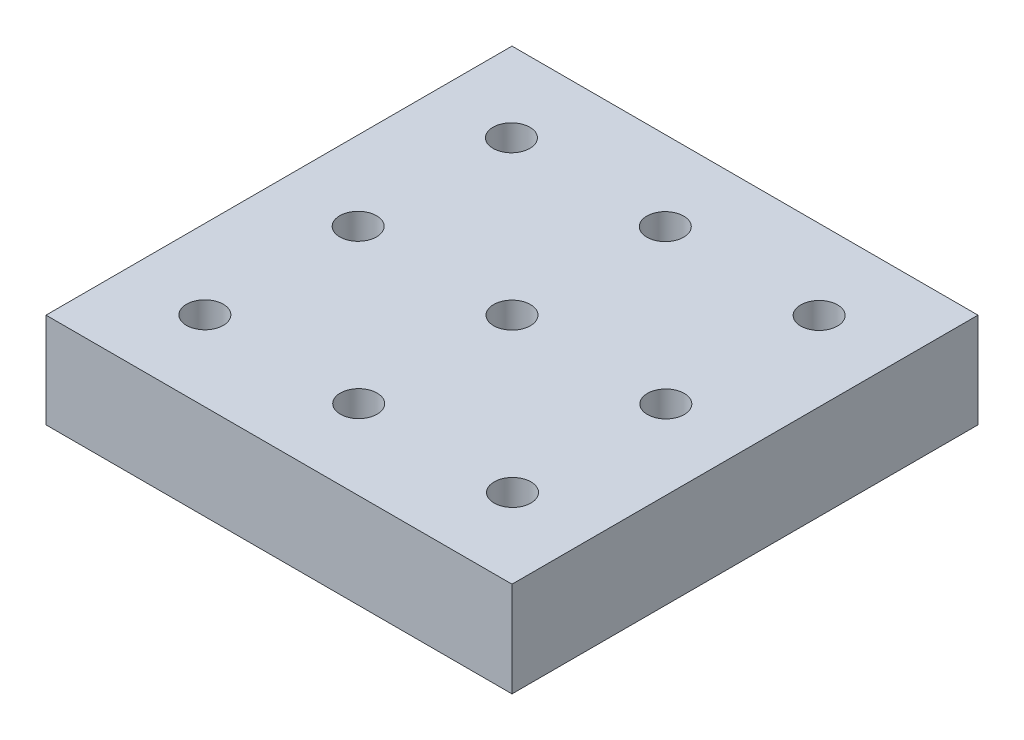
ISO-10303-21;
HEADER;
FILE_DESCRIPTION(('STEP AP214'),'2;1');
FILE_NAME('part.step','',(''),(''),'','','');
FILE_SCHEMA(('AUTOMOTIVE_DESIGN { 1 0 10303 214 1 1 1 1 }'));
ENDSEC;
DATA;
#1=APPLICATION_CONTEXT('core data for automotive mechanical design processes');
#2=APPLICATION_PROTOCOL_DEFINITION('international standard','automotive_design',2000,#1);
#3=PRODUCT_CONTEXT('',#1,'mechanical');
#4=PRODUCT('Part','Part','',(#3));
#5=PRODUCT_RELATED_PRODUCT_CATEGORY('part','',(#4));
#6=PRODUCT_DEFINITION_FORMATION('','',#4);
#7=PRODUCT_DEFINITION_CONTEXT('part definition',#1,'design');
#8=PRODUCT_DEFINITION('design','',#6,#7);
#9=PRODUCT_DEFINITION_SHAPE('','',#8);
#10=(LENGTH_UNIT() NAMED_UNIT(*) SI_UNIT(.MILLI.,.METRE.));
#11=(NAMED_UNIT(*) PLANE_ANGLE_UNIT() SI_UNIT($,.RADIAN.));
#12=(NAMED_UNIT(*) SI_UNIT($,.STERADIAN.) SOLID_ANGLE_UNIT());
#13=UNCERTAINTY_MEASURE_WITH_UNIT(LENGTH_MEASURE(1.E-05),#10,'distance_accuracy_value','');
#14=(GEOMETRIC_REPRESENTATION_CONTEXT(3) GLOBAL_UNCERTAINTY_ASSIGNED_CONTEXT((#13)) GLOBAL_UNIT_ASSIGNED_CONTEXT((#10,
#11,#12)) REPRESENTATION_CONTEXT('',''));
#15=CARTESIAN_POINT('',(0.,0.,0.));
#16=DIRECTION('',(0.,0.,1.));
#17=DIRECTION('',(1.,0.,0.));
#18=AXIS2_PLACEMENT_3D('',#15,#16,#17);
#19=CARTESIAN_POINT('',(0.,15.5,0.));
#20=DIRECTION('',(0.,1.,0.));
#21=DIRECTION('',(0.,0.,1.));
#22=AXIS2_PLACEMENT_3D('',#19,#20,#21);
#23=PLANE('',#22);
#24=CARTESIAN_POINT('',(-159.859666299944,15.5,-56.7102196791404));
#25=DIRECTION('',(0.,1.,0.));
#26=DIRECTION('',(0.,0.,-1.));
#27=AXIS2_PLACEMENT_3D('',#24,#25,#26);
#28=CIRCLE('',#27,2.99999999999999);
#29=CARTESIAN_POINT('',(-159.859666299944,15.5,-59.7102196791404));
#30=VERTEX_POINT('',#29);
#31=EDGE_CURVE('E150',#30,#30,#28,.T.);
#32=ORIENTED_EDGE('',*,*,#31,.F.);
#33=EDGE_LOOP('',(#32));
#34=FACE_BOUND('',#33,.T.);
#35=CARTESIAN_POINT('',(-134.769453056282,15.5,-106.71021967914));
#36=DIRECTION('',(0.,1.,0.));
#37=DIRECTION('',(0.,0.,1.));
#38=AXIS2_PLACEMENT_3D('',#35,#36,#37);
#39=CIRCLE('',#38,2.99999999999999);
#40=CARTESIAN_POINT('',(-134.769453056282,15.5,-103.71021967914));
#41=VERTEX_POINT('',#40);
#42=EDGE_CURVE('E138',#41,#41,#39,.T.);
#43=ORIENTED_EDGE('',*,*,#42,.F.);
#44=EDGE_LOOP('',(#43));
#45=FACE_BOUND('',#44,.T.);
#46=CARTESIAN_POINT('',(-134.769453056282,15.5,-56.7102196791404));
#47=DIRECTION('',(0.,1.,0.));
#48=DIRECTION('',(0.,0.,-1.));
#49=AXIS2_PLACEMENT_3D('',#46,#47,#48);
#50=CIRCLE('',#49,2.99999999999999);
#51=CARTESIAN_POINT('',(-134.769453056282,15.5,-59.7102196791404));
#52=VERTEX_POINT('',#51);
#53=EDGE_CURVE('E126',#52,#52,#50,.T.);
#54=ORIENTED_EDGE('',*,*,#53,.F.);
#55=EDGE_LOOP('',(#54));
#56=FACE_BOUND('',#55,.T.);
#57=CARTESIAN_POINT('',(-134.769453056282,15.5,-81.7102196791404));
#58=DIRECTION('',(0.,1.,0.));
#59=DIRECTION('',(0.,0.,1.));
#60=AXIS2_PLACEMENT_3D('',#57,#58,#59);
#61=CIRCLE('',#60,3.00000000000002);
#62=CARTESIAN_POINT('',(-134.769453056282,15.5,-78.7102196791404));
#63=VERTEX_POINT('',#62);
#64=EDGE_CURVE('E114',#63,#63,#61,.T.);
#65=ORIENTED_EDGE('',*,*,#64,.F.);
#66=EDGE_LOOP('',(#65));
#67=FACE_BOUND('',#66,.T.);
#68=DIRECTION('',(1.,0.,0.));
#69=VECTOR('',#68,1.);
#70=CARTESIAN_POINT('',(-197.859666299944,15.5,-43.7102196791404));
#71=LINE('',#70,#69);
#72=CARTESIAN_POINT('',(-197.859666299944,15.5,-43.7102196791404));
#73=VERTEX_POINT('',#72);
#74=CARTESIAN_POINT('',(-121.859666299944,15.5,-43.7102196791404));
#75=VERTEX_POINT('',#74);
#76=EDGE_CURVE('E84',#73,#75,#71,.T.);
#77=ORIENTED_EDGE('',*,*,#76,.T.);
#78=DIRECTION('',(0.,0.,-1.));
#79=VECTOR('',#78,1.);
#80=CARTESIAN_POINT('',(-121.859666299944,15.5,-43.7102196791404));
#81=LINE('',#80,#79);
#82=CARTESIAN_POINT('',(-121.859666299944,15.5,-119.71021967914));
#83=VERTEX_POINT('',#82);
#84=EDGE_CURVE('E79',#75,#83,#81,.T.);
#85=ORIENTED_EDGE('',*,*,#84,.T.);
#86=DIRECTION('',(-1.,0.,0.));
#87=VECTOR('',#86,1.);
#88=CARTESIAN_POINT('',(-121.859666299944,15.5,-119.71021967914));
#89=LINE('',#88,#87);
#90=CARTESIAN_POINT('',(-197.859666299944,15.5,-119.71021967914));
#91=VERTEX_POINT('',#90);
#92=EDGE_CURVE('E82',#83,#91,#89,.T.);
#93=ORIENTED_EDGE('',*,*,#92,.T.);
#94=DIRECTION('',(0.,0.,1.));
#95=VECTOR('',#94,1.);
#96=CARTESIAN_POINT('',(-197.859666299944,15.5,-119.71021967914));
#97=LINE('',#96,#95);
#98=EDGE_CURVE('E49',#91,#73,#97,.T.);
#99=ORIENTED_EDGE('',*,*,#98,.T.);
#100=EDGE_LOOP('',(#77,#85,#93,#99));
#101=FACE_BOUND('',#100,.T.);
#102=CARTESIAN_POINT('',(-159.859666299944,15.5,-81.7102196791404));
#103=DIRECTION('',(0.,1.,0.));
#104=DIRECTION('',(0.,0.,1.));
#105=AXIS2_PLACEMENT_3D('',#102,#103,#104);
#106=CIRCLE('',#105,2.99999999999999);
#107=CARTESIAN_POINT('',(-159.859666299944,15.5,-78.7102196791404));
#108=VERTEX_POINT('',#107);
#109=EDGE_CURVE('E99',#108,#108,#106,.T.);
#110=ORIENTED_EDGE('',*,*,#109,.F.);
#111=EDGE_LOOP('',(#110));
#112=FACE_BOUND('',#111,.T.);
#113=CARTESIAN_POINT('',(-184.949879543606,15.5,-81.7102196791404));
#114=DIRECTION('',(0.,1.,0.));
#115=DIRECTION('',(0.,0.,-1.));
#116=AXIS2_PLACEMENT_3D('',#113,#114,#115);
#117=CIRCLE('',#116,3.00000000000002);
#118=CARTESIAN_POINT('',(-184.949879543606,15.5,-84.7102196791404));
#119=VERTEX_POINT('',#118);
#120=EDGE_CURVE('E120',#119,#119,#117,.T.);
#121=ORIENTED_EDGE('',*,*,#120,.F.);
#122=EDGE_LOOP('',(#121));
#123=FACE_BOUND('',#122,.T.);
#124=CARTESIAN_POINT('',(-159.859666299944,15.5,-106.71021967914));
#125=DIRECTION('',(0.,1.,0.));
#126=DIRECTION('',(0.,0.,1.));
#127=AXIS2_PLACEMENT_3D('',#124,#125,#126);
#128=CIRCLE('',#127,2.99999999999999);
#129=CARTESIAN_POINT('',(-159.859666299944,15.5,-103.71021967914));
#130=VERTEX_POINT('',#129);
#131=EDGE_CURVE('E132',#130,#130,#128,.T.);
#132=ORIENTED_EDGE('',*,*,#131,.F.);
#133=EDGE_LOOP('',(#132));
#134=FACE_BOUND('',#133,.T.);
#135=CARTESIAN_POINT('',(-184.949879543606,15.5,-106.71021967914));
#136=DIRECTION('',(0.,1.,0.));
#137=DIRECTION('',(0.,0.,-1.));
#138=AXIS2_PLACEMENT_3D('',#135,#136,#137);
#139=CIRCLE('',#138,3.00000000000002);
#140=CARTESIAN_POINT('',(-184.949879543606,15.5,-109.71021967914));
#141=VERTEX_POINT('',#140);
#142=EDGE_CURVE('E144',#141,#141,#139,.T.);
#143=ORIENTED_EDGE('',*,*,#142,.F.);
#144=EDGE_LOOP('',(#143));
#145=FACE_BOUND('',#144,.T.);
#146=CARTESIAN_POINT('',(-184.949879543606,15.5,-56.7102196791404));
#147=DIRECTION('',(0.,1.,0.));
#148=DIRECTION('',(0.,0.,1.));
#149=AXIS2_PLACEMENT_3D('',#146,#147,#148);
#150=CIRCLE('',#149,3.00000000000002);
#151=CARTESIAN_POINT('',(-184.949879543606,15.5,-53.7102196791404));
#152=VERTEX_POINT('',#151);
#153=EDGE_CURVE('E156',#152,#152,#150,.T.);
#154=ORIENTED_EDGE('',*,*,#153,.F.);
#155=EDGE_LOOP('',(#154));
#156=FACE_BOUND('',#155,.T.);
#157=ADVANCED_FACE('F32',(#34,#45,#56,#67,#101,#112,#123,#134,#145,#156),#23,.T.);
#158=CARTESIAN_POINT('',(0.,0.,0.));
#159=DIRECTION('',(0.,1.,0.));
#160=DIRECTION('',(0.,0.,1.));
#161=AXIS2_PLACEMENT_3D('',#158,#159,#160);
#162=PLANE('',#161);
#163=CARTESIAN_POINT('',(-159.859666299944,0.,-56.7102196791404));
#164=DIRECTION('',(0.,1.,0.));
#165=DIRECTION('',(0.,0.,-1.));
#166=AXIS2_PLACEMENT_3D('',#163,#164,#165);
#167=CIRCLE('',#166,2.99999999999999);
#168=CARTESIAN_POINT('',(-159.859666299944,0.,-59.7102196791404));
#169=VERTEX_POINT('',#168);
#170=EDGE_CURVE('E153',#169,#169,#167,.T.);
#171=ORIENTED_EDGE('',*,*,#170,.T.);
#172=EDGE_LOOP('',(#171));
#173=FACE_BOUND('',#172,.T.);
#174=CARTESIAN_POINT('',(-134.769453056282,0.,-106.71021967914));
#175=DIRECTION('',(0.,1.,0.));
#176=DIRECTION('',(0.,0.,1.));
#177=AXIS2_PLACEMENT_3D('',#174,#175,#176);
#178=CIRCLE('',#177,2.99999999999999);
#179=CARTESIAN_POINT('',(-134.769453056282,0.,-103.71021967914));
#180=VERTEX_POINT('',#179);
#181=EDGE_CURVE('E141',#180,#180,#178,.T.);
#182=ORIENTED_EDGE('',*,*,#181,.T.);
#183=EDGE_LOOP('',(#182));
#184=FACE_BOUND('',#183,.T.);
#185=CARTESIAN_POINT('',(-134.769453056282,0.,-56.7102196791404));
#186=DIRECTION('',(0.,1.,0.));
#187=DIRECTION('',(0.,0.,-1.));
#188=AXIS2_PLACEMENT_3D('',#185,#186,#187);
#189=CIRCLE('',#188,2.99999999999999);
#190=CARTESIAN_POINT('',(-134.769453056282,0.,-59.7102196791404));
#191=VERTEX_POINT('',#190);
#192=EDGE_CURVE('E129',#191,#191,#189,.T.);
#193=ORIENTED_EDGE('',*,*,#192,.T.);
#194=EDGE_LOOP('',(#193));
#195=FACE_BOUND('',#194,.T.);
#196=CARTESIAN_POINT('',(-134.769453056282,0.,-81.7102196791404));
#197=DIRECTION('',(0.,1.,0.));
#198=DIRECTION('',(0.,0.,1.));
#199=AXIS2_PLACEMENT_3D('',#196,#197,#198);
#200=CIRCLE('',#199,3.00000000000002);
#201=CARTESIAN_POINT('',(-134.769453056282,0.,-78.7102196791404));
#202=VERTEX_POINT('',#201);
#203=EDGE_CURVE('E117',#202,#202,#200,.T.);
#204=ORIENTED_EDGE('',*,*,#203,.T.);
#205=EDGE_LOOP('',(#204));
#206=FACE_BOUND('',#205,.T.);
#207=DIRECTION('',(1.,0.,0.));
#208=VECTOR('',#207,1.);
#209=CARTESIAN_POINT('',(-197.859666299944,0.,-43.7102196791404));
#210=LINE('',#209,#208);
#211=CARTESIAN_POINT('',(-197.859666299944,0.,-43.7102196791404));
#212=VERTEX_POINT('',#211);
#213=CARTESIAN_POINT('',(-121.859666299944,0.,-43.7102196791404));
#214=VERTEX_POINT('',#213);
#215=EDGE_CURVE('E96',#212,#214,#210,.T.);
#216=ORIENTED_EDGE('',*,*,#215,.F.);
#217=DIRECTION('',(0.,0.,1.));
#218=VECTOR('',#217,1.);
#219=CARTESIAN_POINT('',(-197.859666299944,0.,-119.71021967914));
#220=LINE('',#219,#218);
#221=CARTESIAN_POINT('',(-197.859666299944,0.,-119.71021967914));
#222=VERTEX_POINT('',#221);
#223=EDGE_CURVE('E72',#222,#212,#220,.T.);
#224=ORIENTED_EDGE('',*,*,#223,.F.);
#225=DIRECTION('',(-1.,0.,0.));
#226=VECTOR('',#225,1.);
#227=CARTESIAN_POINT('',(-121.859666299944,0.,-119.71021967914));
#228=LINE('',#227,#226);
#229=CARTESIAN_POINT('',(-121.859666299944,0.,-119.71021967914));
#230=VERTEX_POINT('',#229);
#231=EDGE_CURVE('E66',#230,#222,#228,.T.);
#232=ORIENTED_EDGE('',*,*,#231,.F.);
#233=DIRECTION('',(0.,0.,-1.));
#234=VECTOR('',#233,1.);
#235=CARTESIAN_POINT('',(-121.859666299944,0.,-43.7102196791404));
#236=LINE('',#235,#234);
#237=EDGE_CURVE('E88',#214,#230,#236,.T.);
#238=ORIENTED_EDGE('',*,*,#237,.F.);
#239=EDGE_LOOP('',(#216,#224,#232,#238));
#240=FACE_BOUND('',#239,.T.);
#241=CARTESIAN_POINT('',(-159.859666299944,0.,-81.7102196791404));
#242=DIRECTION('',(0.,1.,0.));
#243=DIRECTION('',(0.,0.,1.));
#244=AXIS2_PLACEMENT_3D('',#241,#242,#243);
#245=CIRCLE('',#244,2.99999999999999);
#246=CARTESIAN_POINT('',(-159.859666299944,0.,-78.7102196791404));
#247=VERTEX_POINT('',#246);
#248=EDGE_CURVE('E111',#247,#247,#245,.T.);
#249=ORIENTED_EDGE('',*,*,#248,.T.);
#250=EDGE_LOOP('',(#249));
#251=FACE_BOUND('',#250,.T.);
#252=CARTESIAN_POINT('',(-184.949879543606,0.,-81.7102196791404));
#253=DIRECTION('',(0.,1.,0.));
#254=DIRECTION('',(0.,0.,-1.));
#255=AXIS2_PLACEMENT_3D('',#252,#253,#254);
#256=CIRCLE('',#255,3.00000000000002);
#257=CARTESIAN_POINT('',(-184.949879543606,0.,-84.7102196791404));
#258=VERTEX_POINT('',#257);
#259=EDGE_CURVE('E123',#258,#258,#256,.T.);
#260=ORIENTED_EDGE('',*,*,#259,.T.);
#261=EDGE_LOOP('',(#260));
#262=FACE_BOUND('',#261,.T.);
#263=CARTESIAN_POINT('',(-159.859666299944,0.,-106.71021967914));
#264=DIRECTION('',(0.,1.,0.));
#265=DIRECTION('',(0.,0.,1.));
#266=AXIS2_PLACEMENT_3D('',#263,#264,#265);
#267=CIRCLE('',#266,2.99999999999999);
#268=CARTESIAN_POINT('',(-159.859666299944,0.,-103.71021967914));
#269=VERTEX_POINT('',#268);
#270=EDGE_CURVE('E135',#269,#269,#267,.T.);
#271=ORIENTED_EDGE('',*,*,#270,.T.);
#272=EDGE_LOOP('',(#271));
#273=FACE_BOUND('',#272,.T.);
#274=CARTESIAN_POINT('',(-184.949879543606,0.,-106.71021967914));
#275=DIRECTION('',(0.,1.,0.));
#276=DIRECTION('',(0.,0.,-1.));
#277=AXIS2_PLACEMENT_3D('',#274,#275,#276);
#278=CIRCLE('',#277,3.00000000000002);
#279=CARTESIAN_POINT('',(-184.949879543606,0.,-109.71021967914));
#280=VERTEX_POINT('',#279);
#281=EDGE_CURVE('E147',#280,#280,#278,.T.);
#282=ORIENTED_EDGE('',*,*,#281,.T.);
#283=EDGE_LOOP('',(#282));
#284=FACE_BOUND('',#283,.T.);
#285=CARTESIAN_POINT('',(-184.949879543606,0.,-56.7102196791404));
#286=DIRECTION('',(0.,1.,0.));
#287=DIRECTION('',(0.,0.,1.));
#288=AXIS2_PLACEMENT_3D('',#285,#286,#287);
#289=CIRCLE('',#288,3.00000000000002);
#290=CARTESIAN_POINT('',(-184.949879543606,0.,-53.7102196791404));
#291=VERTEX_POINT('',#290);
#292=EDGE_CURVE('E159',#291,#291,#289,.T.);
#293=ORIENTED_EDGE('',*,*,#292,.T.);
#294=EDGE_LOOP('',(#293));
#295=FACE_BOUND('',#294,.T.);
#296=ADVANCED_FACE('F107',(#173,#184,#195,#206,#240,#251,#262,#273,#284,#295),#162,.F.);
#297=CARTESIAN_POINT('',(-197.859666299944,15.5,-43.7102196791404));
#298=DIRECTION('',(0.,0.,-1.));
#299=DIRECTION('',(-1.,0.,0.));
#300=AXIS2_PLACEMENT_3D('',#297,#298,#299);
#301=PLANE('',#300);
#302=ORIENTED_EDGE('',*,*,#215,.T.);
#303=DIRECTION('',(0.,-1.,0.));
#304=VECTOR('',#303,1.);
#305=CARTESIAN_POINT('',(-121.859666299944,15.5,-43.7102196791404));
#306=LINE('',#305,#304);
#307=EDGE_CURVE('E11',#75,#214,#306,.T.);
#308=ORIENTED_EDGE('',*,*,#307,.F.);
#309=ORIENTED_EDGE('',*,*,#76,.F.);
#310=DIRECTION('',(0.,-1.,0.));
#311=VECTOR('',#310,1.);
#312=CARTESIAN_POINT('',(-197.859666299944,15.5,-43.7102196791404));
#313=LINE('',#312,#311);
#314=EDGE_CURVE('E92',#73,#212,#313,.T.);
#315=ORIENTED_EDGE('',*,*,#314,.T.);
#316=EDGE_LOOP('',(#302,#308,#309,#315));
#317=FACE_BOUND('',#316,.T.);
#318=ADVANCED_FACE('F34',(#317),#301,.F.);
#319=CARTESIAN_POINT('',(-121.859666299944,15.5,-43.7102196791404));
#320=DIRECTION('',(-1.,0.,0.));
#321=DIRECTION('',(0.,0.,1.));
#322=AXIS2_PLACEMENT_3D('',#319,#320,#321);
#323=PLANE('',#322);
#324=ORIENTED_EDGE('',*,*,#237,.T.);
#325=DIRECTION('',(0.,-1.,0.));
#326=VECTOR('',#325,1.);
#327=CARTESIAN_POINT('',(-121.859666299944,15.5,-119.71021967914));
#328=LINE('',#327,#326);
#329=EDGE_CURVE('E41',#83,#230,#328,.T.);
#330=ORIENTED_EDGE('',*,*,#329,.F.);
#331=ORIENTED_EDGE('',*,*,#84,.F.);
#332=ORIENTED_EDGE('',*,*,#307,.T.);
#333=EDGE_LOOP('',(#324,#330,#331,#332));
#334=FACE_BOUND('',#333,.T.);
#335=ADVANCED_FACE('F87',(#334),#323,.F.);
#336=CARTESIAN_POINT('',(-121.859666299944,15.5,-119.71021967914));
#337=DIRECTION('',(0.,0.,1.));
#338=DIRECTION('',(1.,0.,0.));
#339=AXIS2_PLACEMENT_3D('',#336,#337,#338);
#340=PLANE('',#339);
#341=ORIENTED_EDGE('',*,*,#231,.T.);
#342=DIRECTION('',(0.,-1.,0.));
#343=VECTOR('',#342,1.);
#344=CARTESIAN_POINT('',(-197.859666299944,15.5,-119.71021967914));
#345=LINE('',#344,#343);
#346=EDGE_CURVE('E89',#91,#222,#345,.T.);
#347=ORIENTED_EDGE('',*,*,#346,.F.);
#348=ORIENTED_EDGE('',*,*,#92,.F.);
#349=ORIENTED_EDGE('',*,*,#329,.T.);
#350=EDGE_LOOP('',(#341,#347,#348,#349));
#351=FACE_BOUND('',#350,.T.);
#352=ADVANCED_FACE('F90',(#351),#340,.F.);
#353=CARTESIAN_POINT('',(-197.859666299944,15.5,-119.71021967914));
#354=DIRECTION('',(1.,0.,0.));
#355=DIRECTION('',(0.,0.,-1.));
#356=AXIS2_PLACEMENT_3D('',#353,#354,#355);
#357=PLANE('',#356);
#358=ORIENTED_EDGE('',*,*,#223,.T.);
#359=ORIENTED_EDGE('',*,*,#314,.F.);
#360=ORIENTED_EDGE('',*,*,#98,.F.);
#361=ORIENTED_EDGE('',*,*,#346,.T.);
#362=EDGE_LOOP('',(#358,#359,#360,#361));
#363=FACE_BOUND('',#362,.T.);
#364=ADVANCED_FACE('F104',(#363),#357,.F.);
#365=CARTESIAN_POINT('',(-159.859666299944,15.5,-81.7102196791404));
#366=DIRECTION('',(0.,-1.,0.));
#367=DIRECTION('',(0.,0.,-1.));
#368=AXIS2_PLACEMENT_3D('',#365,#366,#367);
#369=CYLINDRICAL_SURFACE('',#368,2.99999999999999);
#370=ORIENTED_EDGE('',*,*,#109,.T.);
#371=EDGE_LOOP('',(#370));
#372=FACE_BOUND('',#371,.T.);
#373=ORIENTED_EDGE('',*,*,#248,.F.);
#374=EDGE_LOOP('',(#373));
#375=FACE_BOUND('',#374,.T.);
#376=ADVANCED_FACE('F179',(#372,#375),#369,.F.);
#377=CARTESIAN_POINT('',(-134.769453056282,15.5,-81.7102196791404));
#378=DIRECTION('',(0.,-1.,0.));
#379=DIRECTION('',(0.,0.,-1.));
#380=AXIS2_PLACEMENT_3D('',#377,#378,#379);
#381=CYLINDRICAL_SURFACE('',#380,3.00000000000002);
#382=ORIENTED_EDGE('',*,*,#64,.T.);
#383=EDGE_LOOP('',(#382));
#384=FACE_BOUND('',#383,.T.);
#385=ORIENTED_EDGE('',*,*,#203,.F.);
#386=EDGE_LOOP('',(#385));
#387=FACE_BOUND('',#386,.T.);
#388=ADVANCED_FACE('F225',(#384,#387),#381,.F.);
#389=CARTESIAN_POINT('',(-184.949879543606,15.5,-81.7102196791404));
#390=DIRECTION('',(0.,-1.,0.));
#391=DIRECTION('',(0.,0.,-1.));
#392=AXIS2_PLACEMENT_3D('',#389,#390,#391);
#393=CYLINDRICAL_SURFACE('',#392,3.00000000000002);
#394=ORIENTED_EDGE('',*,*,#120,.T.);
#395=EDGE_LOOP('',(#394));
#396=FACE_BOUND('',#395,.T.);
#397=ORIENTED_EDGE('',*,*,#259,.F.);
#398=EDGE_LOOP('',(#397));
#399=FACE_BOUND('',#398,.T.);
#400=ADVANCED_FACE('F233',(#396,#399),#393,.F.);
#401=CARTESIAN_POINT('',(-134.769453056282,15.5,-56.7102196791404));
#402=DIRECTION('',(0.,-1.,0.));
#403=DIRECTION('',(0.,0.,-1.));
#404=AXIS2_PLACEMENT_3D('',#401,#402,#403);
#405=CYLINDRICAL_SURFACE('',#404,2.99999999999999);
#406=ORIENTED_EDGE('',*,*,#53,.T.);
#407=EDGE_LOOP('',(#406));
#408=FACE_BOUND('',#407,.T.);
#409=ORIENTED_EDGE('',*,*,#192,.F.);
#410=EDGE_LOOP('',(#409));
#411=FACE_BOUND('',#410,.T.);
#412=ADVANCED_FACE('F241',(#408,#411),#405,.F.);
#413=CARTESIAN_POINT('',(-159.859666299944,15.5,-106.71021967914));
#414=DIRECTION('',(0.,-1.,0.));
#415=DIRECTION('',(0.,0.,-1.));
#416=AXIS2_PLACEMENT_3D('',#413,#414,#415);
#417=CYLINDRICAL_SURFACE('',#416,2.99999999999999);
#418=ORIENTED_EDGE('',*,*,#131,.T.);
#419=EDGE_LOOP('',(#418));
#420=FACE_BOUND('',#419,.T.);
#421=ORIENTED_EDGE('',*,*,#270,.F.);
#422=EDGE_LOOP('',(#421));
#423=FACE_BOUND('',#422,.T.);
#424=ADVANCED_FACE('F250',(#420,#423),#417,.F.);
#425=CARTESIAN_POINT('',(-134.769453056282,15.5,-106.71021967914));
#426=DIRECTION('',(0.,-1.,0.));
#427=DIRECTION('',(0.,0.,-1.));
#428=AXIS2_PLACEMENT_3D('',#425,#426,#427);
#429=CYLINDRICAL_SURFACE('',#428,2.99999999999999);
#430=ORIENTED_EDGE('',*,*,#42,.T.);
#431=EDGE_LOOP('',(#430));
#432=FACE_BOUND('',#431,.T.);
#433=ORIENTED_EDGE('',*,*,#181,.F.);
#434=EDGE_LOOP('',(#433));
#435=FACE_BOUND('',#434,.T.);
#436=ADVANCED_FACE('F259',(#432,#435),#429,.F.);
#437=CARTESIAN_POINT('',(-184.949879543606,15.5,-106.71021967914));
#438=DIRECTION('',(0.,-1.,0.));
#439=DIRECTION('',(0.,0.,-1.));
#440=AXIS2_PLACEMENT_3D('',#437,#438,#439);
#441=CYLINDRICAL_SURFACE('',#440,3.00000000000002);
#442=ORIENTED_EDGE('',*,*,#142,.T.);
#443=EDGE_LOOP('',(#442));
#444=FACE_BOUND('',#443,.T.);
#445=ORIENTED_EDGE('',*,*,#281,.F.);
#446=EDGE_LOOP('',(#445));
#447=FACE_BOUND('',#446,.T.);
#448=ADVANCED_FACE('F268',(#444,#447),#441,.F.);
#449=CARTESIAN_POINT('',(-159.859666299944,15.5,-56.7102196791404));
#450=DIRECTION('',(0.,-1.,0.));
#451=DIRECTION('',(0.,0.,-1.));
#452=AXIS2_PLACEMENT_3D('',#449,#450,#451);
#453=CYLINDRICAL_SURFACE('',#452,2.99999999999999);
#454=ORIENTED_EDGE('',*,*,#31,.T.);
#455=EDGE_LOOP('',(#454));
#456=FACE_BOUND('',#455,.T.);
#457=ORIENTED_EDGE('',*,*,#170,.F.);
#458=EDGE_LOOP('',(#457));
#459=FACE_BOUND('',#458,.T.);
#460=ADVANCED_FACE('F277',(#456,#459),#453,.F.);
#461=CARTESIAN_POINT('',(-184.949879543606,15.5,-56.7102196791404));
#462=DIRECTION('',(0.,-1.,0.));
#463=DIRECTION('',(0.,0.,-1.));
#464=AXIS2_PLACEMENT_3D('',#461,#462,#463);
#465=CYLINDRICAL_SURFACE('',#464,3.00000000000002);
#466=ORIENTED_EDGE('',*,*,#153,.T.);
#467=EDGE_LOOP('',(#466));
#468=FACE_BOUND('',#467,.T.);
#469=ORIENTED_EDGE('',*,*,#292,.F.);
#470=EDGE_LOOP('',(#469));
#471=FACE_BOUND('',#470,.T.);
#472=ADVANCED_FACE('F165',(#468,#471),#465,.F.);
#473=CLOSED_SHELL('',(#157,#296,#318,#335,#352,#364,#376,#388,#400,#412,#424,#436,#448,#460,#472));
#474=MANIFOLD_SOLID_BREP('B2',#473);
#475=ADVANCED_BREP_SHAPE_REPRESENTATION('',(#18,#474),#14);
#476=SHAPE_DEFINITION_REPRESENTATION(#9,#475);
ENDSEC;
END-ISO-10303-21;
